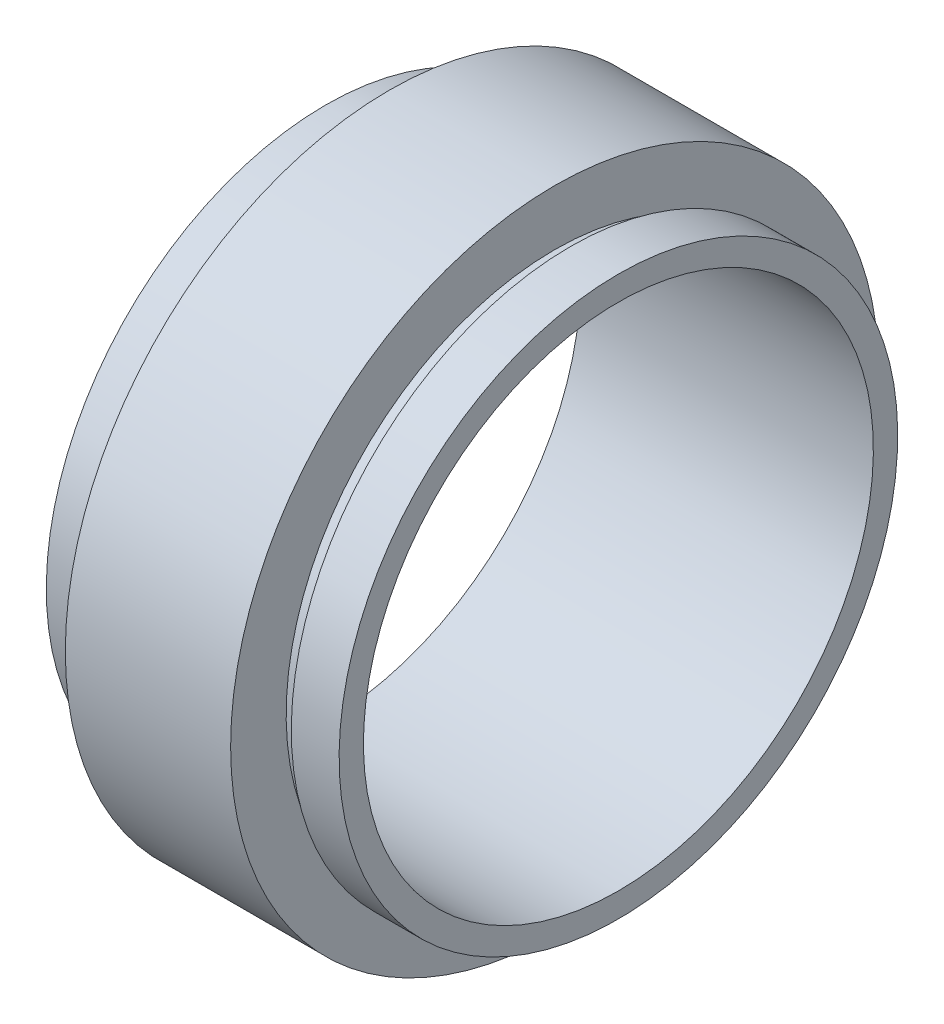
ISO-10303-21;
HEADER;
FILE_DESCRIPTION(('STEP AP214'),'2;1');
FILE_NAME('part.step','',(''),(''),'','','');
FILE_SCHEMA(('AUTOMOTIVE_DESIGN { 1 0 10303 214 1 1 1 1 }'));
ENDSEC;
DATA;
#1=APPLICATION_CONTEXT('core data for automotive mechanical design processes');
#2=APPLICATION_PROTOCOL_DEFINITION('international standard','automotive_design',2000,#1);
#3=PRODUCT_CONTEXT('',#1,'mechanical');
#4=PRODUCT('Part','Part','',(#3));
#5=PRODUCT_RELATED_PRODUCT_CATEGORY('part','',(#4));
#6=PRODUCT_DEFINITION_FORMATION('','',#4);
#7=PRODUCT_DEFINITION_CONTEXT('part definition',#1,'design');
#8=PRODUCT_DEFINITION('design','',#6,#7);
#9=PRODUCT_DEFINITION_SHAPE('','',#8);
#10=(LENGTH_UNIT() NAMED_UNIT(*) SI_UNIT(.MILLI.,.METRE.));
#11=(NAMED_UNIT(*) PLANE_ANGLE_UNIT() SI_UNIT($,.RADIAN.));
#12=(NAMED_UNIT(*) SI_UNIT($,.STERADIAN.) SOLID_ANGLE_UNIT());
#13=UNCERTAINTY_MEASURE_WITH_UNIT(LENGTH_MEASURE(1.E-05),#10,'distance_accuracy_value','');
#14=(GEOMETRIC_REPRESENTATION_CONTEXT(3) GLOBAL_UNCERTAINTY_ASSIGNED_CONTEXT((#13)) GLOBAL_UNIT_ASSIGNED_CONTEXT((#10,
#11,#12)) REPRESENTATION_CONTEXT('',''));
#15=CARTESIAN_POINT('',(0.,0.,0.));
#16=DIRECTION('',(0.,0.,1.));
#17=DIRECTION('',(1.,0.,0.));
#18=AXIS2_PLACEMENT_3D('',#15,#16,#17);
#19=CARTESIAN_POINT('',(6.89,13.1445,0.));
#20=DIRECTION('',(1.,0.,0.));
#21=DIRECTION('',(0.,1.,0.));
#22=AXIS2_PLACEMENT_3D('',#19,#20,#21);
#23=PLANE('',#22);
#24=CARTESIAN_POINT('',(6.89,0.,0.));
#25=DIRECTION('',(-1.,0.,0.));
#26=DIRECTION('',(0.,-1.,0.));
#27=AXIS2_PLACEMENT_3D('',#24,#25,#26);
#28=CIRCLE('',#27,12.);
#29=CARTESIAN_POINT('',(6.89,-12.,0.));
#30=VERTEX_POINT('',#29);
#31=EDGE_CURVE('E71',#30,#30,#28,.T.);
#32=ORIENTED_EDGE('',*,*,#31,.T.);
#33=EDGE_LOOP('',(#32));
#34=FACE_BOUND('',#33,.T.);
#35=CARTESIAN_POINT('',(6.89,0.,0.));
#36=DIRECTION('',(1.,0.,0.));
#37=DIRECTION('',(0.,1.,0.));
#38=AXIS2_PLACEMENT_3D('',#35,#36,#37);
#39=CIRCLE('',#38,13.1445);
#40=CARTESIAN_POINT('',(6.89,13.1445,0.));
#41=VERTEX_POINT('',#40);
#42=EDGE_CURVE('E68',#41,#41,#39,.T.);
#43=ORIENTED_EDGE('',*,*,#42,.T.);
#44=EDGE_LOOP('',(#43));
#45=FACE_BOUND('',#44,.T.);
#46=ADVANCED_FACE('F34',(#34,#45),#23,.T.);
#47=CARTESIAN_POINT('',(-6.89,0.,0.));
#48=DIRECTION('',(-1.,0.,0.));
#49=DIRECTION('',(0.,-1.,0.));
#50=AXIS2_PLACEMENT_3D('',#47,#48,#49);
#51=PLANE('',#50);
#52=CARTESIAN_POINT('',(-6.89,0.,0.));
#53=DIRECTION('',(-1.,0.,0.));
#54=DIRECTION('',(0.,-1.,0.));
#55=AXIS2_PLACEMENT_3D('',#52,#53,#54);
#56=CIRCLE('',#55,12.);
#57=CARTESIAN_POINT('',(-6.89,-12.,0.));
#58=VERTEX_POINT('',#57);
#59=EDGE_CURVE('E72',#58,#58,#56,.T.);
#60=ORIENTED_EDGE('',*,*,#59,.F.);
#61=EDGE_LOOP('',(#60));
#62=FACE_BOUND('',#61,.T.);
#63=CARTESIAN_POINT('',(-6.89,0.,0.));
#64=DIRECTION('',(1.,0.,0.));
#65=DIRECTION('',(0.,1.,0.));
#66=AXIS2_PLACEMENT_3D('',#63,#64,#65);
#67=CIRCLE('',#66,13.1445);
#68=CARTESIAN_POINT('',(-6.89,13.1445,0.));
#69=VERTEX_POINT('',#68);
#70=EDGE_CURVE('E10',#69,#69,#67,.T.);
#71=ORIENTED_EDGE('',*,*,#70,.F.);
#72=EDGE_LOOP('',(#71));
#73=FACE_BOUND('',#72,.T.);
#74=ADVANCED_FACE('F87',(#62,#73),#51,.T.);
#75=CARTESIAN_POINT('',(6.89,0.,0.));
#76=DIRECTION('',(1.,0.,0.));
#77=DIRECTION('',(0.,1.,0.));
#78=AXIS2_PLACEMENT_3D('',#75,#76,#77);
#79=CYLINDRICAL_SURFACE('',#78,13.1445);
#80=ORIENTED_EDGE('',*,*,#70,.T.);
#81=EDGE_LOOP('',(#80));
#82=FACE_BOUND('',#81,.T.);
#83=CARTESIAN_POINT('',(-4.64,0.,0.));
#84=DIRECTION('',(1.,0.,0.));
#85=DIRECTION('',(0.,1.,0.));
#86=AXIS2_PLACEMENT_3D('',#83,#84,#85);
#87=CIRCLE('',#86,13.1445);
#88=CARTESIAN_POINT('',(-4.64,13.1445,0.));
#89=VERTEX_POINT('',#88);
#90=EDGE_CURVE('E40',#89,#89,#87,.T.);
#91=ORIENTED_EDGE('',*,*,#90,.F.);
#92=EDGE_LOOP('',(#91));
#93=FACE_BOUND('',#92,.T.);
#94=ADVANCED_FACE('F90',(#82,#93),#79,.T.);
#95=CARTESIAN_POINT('',(-4.64,13.1445,0.));
#96=DIRECTION('',(1.,0.,0.));
#97=DIRECTION('',(0.,1.,0.));
#98=AXIS2_PLACEMENT_3D('',#95,#96,#97);
#99=PLANE('',#98);
#100=ORIENTED_EDGE('',*,*,#90,.T.);
#101=EDGE_LOOP('',(#100));
#102=FACE_BOUND('',#101,.T.);
#103=CARTESIAN_POINT('',(-4.64,0.,0.));
#104=DIRECTION('',(1.,0.,0.));
#105=DIRECTION('',(0.,1.,0.));
#106=AXIS2_PLACEMENT_3D('',#103,#104,#105);
#107=CIRCLE('',#106,12.6365);
#108=CARTESIAN_POINT('',(-4.64,12.6365,0.));
#109=VERTEX_POINT('',#108);
#110=EDGE_CURVE('E44',#109,#109,#107,.T.);
#111=ORIENTED_EDGE('',*,*,#110,.F.);
#112=EDGE_LOOP('',(#111));
#113=FACE_BOUND('',#112,.T.);
#114=ADVANCED_FACE('F95',(#102,#113),#99,.T.);
#115=CARTESIAN_POINT('',(6.89,0.,0.));
#116=DIRECTION('',(1.,0.,0.));
#117=DIRECTION('',(0.,1.,0.));
#118=AXIS2_PLACEMENT_3D('',#115,#116,#117);
#119=CYLINDRICAL_SURFACE('',#118,12.6365);
#120=ORIENTED_EDGE('',*,*,#110,.T.);
#121=EDGE_LOOP('',(#120));
#122=FACE_BOUND('',#121,.T.);
#123=CARTESIAN_POINT('',(-3.89,0.,0.));
#124=DIRECTION('',(1.,0.,0.));
#125=DIRECTION('',(0.,1.,0.));
#126=AXIS2_PLACEMENT_3D('',#123,#124,#125);
#127=CIRCLE('',#126,12.6365);
#128=CARTESIAN_POINT('',(-3.89,12.6365,0.));
#129=VERTEX_POINT('',#128);
#130=EDGE_CURVE('E48',#129,#129,#127,.T.);
#131=ORIENTED_EDGE('',*,*,#130,.F.);
#132=EDGE_LOOP('',(#131));
#133=FACE_BOUND('',#132,.T.);
#134=ADVANCED_FACE('F100',(#122,#133),#119,.T.);
#135=CARTESIAN_POINT('',(-3.89,12.6365,0.));
#136=DIRECTION('',(-1.,0.,0.));
#137=DIRECTION('',(0.,-1.,0.));
#138=AXIS2_PLACEMENT_3D('',#135,#136,#137);
#139=PLANE('',#138);
#140=ORIENTED_EDGE('',*,*,#130,.T.);
#141=EDGE_LOOP('',(#140));
#142=FACE_BOUND('',#141,.T.);
#143=CARTESIAN_POINT('',(-3.89,0.,0.));
#144=DIRECTION('',(1.,0.,0.));
#145=DIRECTION('',(0.,1.,0.));
#146=AXIS2_PLACEMENT_3D('',#143,#144,#145);
#147=CIRCLE('',#146,15.25);
#148=CARTESIAN_POINT('',(-3.89,15.25,0.));
#149=VERTEX_POINT('',#148);
#150=EDGE_CURVE('E53',#149,#149,#147,.T.);
#151=ORIENTED_EDGE('',*,*,#150,.F.);
#152=EDGE_LOOP('',(#151));
#153=FACE_BOUND('',#152,.T.);
#154=ADVANCED_FACE('F103',(#142,#153),#139,.T.);
#155=CARTESIAN_POINT('',(6.89,0.,0.));
#156=DIRECTION('',(1.,0.,0.));
#157=DIRECTION('',(0.,1.,0.));
#158=AXIS2_PLACEMENT_3D('',#155,#156,#157);
#159=CYLINDRICAL_SURFACE('',#158,15.25);
#160=ORIENTED_EDGE('',*,*,#150,.T.);
#161=EDGE_LOOP('',(#160));
#162=FACE_BOUND('',#161,.T.);
#163=CARTESIAN_POINT('',(3.89,0.,0.));
#164=DIRECTION('',(1.,0.,0.));
#165=DIRECTION('',(0.,1.,0.));
#166=AXIS2_PLACEMENT_3D('',#163,#164,#165);
#167=CIRCLE('',#166,15.25);
#168=CARTESIAN_POINT('',(3.89,15.25,0.));
#169=VERTEX_POINT('',#168);
#170=EDGE_CURVE('E56',#169,#169,#167,.T.);
#171=ORIENTED_EDGE('',*,*,#170,.F.);
#172=EDGE_LOOP('',(#171));
#173=FACE_BOUND('',#172,.T.);
#174=ADVANCED_FACE('F107',(#162,#173),#159,.T.);
#175=CARTESIAN_POINT('',(3.89,15.25,0.));
#176=DIRECTION('',(1.,0.,0.));
#177=DIRECTION('',(0.,1.,0.));
#178=AXIS2_PLACEMENT_3D('',#175,#176,#177);
#179=PLANE('',#178);
#180=ORIENTED_EDGE('',*,*,#170,.T.);
#181=EDGE_LOOP('',(#180));
#182=FACE_BOUND('',#181,.T.);
#183=CARTESIAN_POINT('',(3.89,0.,0.));
#184=DIRECTION('',(1.,0.,0.));
#185=DIRECTION('',(0.,1.,0.));
#186=AXIS2_PLACEMENT_3D('',#183,#184,#185);
#187=CIRCLE('',#186,12.6365);
#188=CARTESIAN_POINT('',(3.89,12.6365,0.));
#189=VERTEX_POINT('',#188);
#190=EDGE_CURVE('E59',#189,#189,#187,.T.);
#191=ORIENTED_EDGE('',*,*,#190,.F.);
#192=EDGE_LOOP('',(#191));
#193=FACE_BOUND('',#192,.T.);
#194=ADVANCED_FACE('F111',(#182,#193),#179,.T.);
#195=CARTESIAN_POINT('',(6.89,0.,0.));
#196=DIRECTION('',(1.,0.,0.));
#197=DIRECTION('',(0.,1.,0.));
#198=AXIS2_PLACEMENT_3D('',#195,#196,#197);
#199=CYLINDRICAL_SURFACE('',#198,12.6365);
#200=ORIENTED_EDGE('',*,*,#190,.T.);
#201=EDGE_LOOP('',(#200));
#202=FACE_BOUND('',#201,.T.);
#203=CARTESIAN_POINT('',(4.64,0.,0.));
#204=DIRECTION('',(1.,0.,0.));
#205=DIRECTION('',(0.,1.,0.));
#206=AXIS2_PLACEMENT_3D('',#203,#204,#205);
#207=CIRCLE('',#206,12.6365);
#208=CARTESIAN_POINT('',(4.64,12.6365,0.));
#209=VERTEX_POINT('',#208);
#210=EDGE_CURVE('E62',#209,#209,#207,.T.);
#211=ORIENTED_EDGE('',*,*,#210,.F.);
#212=EDGE_LOOP('',(#211));
#213=FACE_BOUND('',#212,.T.);
#214=ADVANCED_FACE('F115',(#202,#213),#199,.T.);
#215=CARTESIAN_POINT('',(4.64,12.6365,0.));
#216=DIRECTION('',(-1.,0.,0.));
#217=DIRECTION('',(0.,-1.,0.));
#218=AXIS2_PLACEMENT_3D('',#215,#216,#217);
#219=PLANE('',#218);
#220=ORIENTED_EDGE('',*,*,#210,.T.);
#221=EDGE_LOOP('',(#220));
#222=FACE_BOUND('',#221,.T.);
#223=CARTESIAN_POINT('',(4.64,0.,0.));
#224=DIRECTION('',(1.,0.,0.));
#225=DIRECTION('',(0.,1.,0.));
#226=AXIS2_PLACEMENT_3D('',#223,#224,#225);
#227=CIRCLE('',#226,13.1445);
#228=CARTESIAN_POINT('',(4.64,13.1445,0.));
#229=VERTEX_POINT('',#228);
#230=EDGE_CURVE('E65',#229,#229,#227,.T.);
#231=ORIENTED_EDGE('',*,*,#230,.F.);
#232=EDGE_LOOP('',(#231));
#233=FACE_BOUND('',#232,.T.);
#234=ADVANCED_FACE('F119',(#222,#233),#219,.T.);
#235=CARTESIAN_POINT('',(6.89,0.,0.));
#236=DIRECTION('',(1.,0.,0.));
#237=DIRECTION('',(0.,1.,0.));
#238=AXIS2_PLACEMENT_3D('',#235,#236,#237);
#239=CYLINDRICAL_SURFACE('',#238,13.1445);
#240=ORIENTED_EDGE('',*,*,#230,.T.);
#241=EDGE_LOOP('',(#240));
#242=FACE_BOUND('',#241,.T.);
#243=ORIENTED_EDGE('',*,*,#42,.F.);
#244=EDGE_LOOP('',(#243));
#245=FACE_BOUND('',#244,.T.);
#246=ADVANCED_FACE('F83',(#242,#245),#239,.T.);
#247=CARTESIAN_POINT('',(6.89,0.,0.));
#248=DIRECTION('',(-1.,0.,0.));
#249=DIRECTION('',(0.,-1.,0.));
#250=AXIS2_PLACEMENT_3D('',#247,#248,#249);
#251=CYLINDRICAL_SURFACE('',#250,12.);
#252=CARTESIAN_POINT('',(6.89,-12.,0.));
#253=CARTESIAN_POINT('',(6.74645833333333,-12.,0.));
#254=CARTESIAN_POINT('',(6.60291666666667,-12.,0.));
#255=CARTESIAN_POINT('',(6.31583333333333,-12.,0.));
#256=CARTESIAN_POINT('',(6.17229166666667,-12.,0.));
#257=CARTESIAN_POINT('',(5.88520833333333,-12.,0.));
#258=CARTESIAN_POINT('',(5.74166666666667,-12.,0.));
#259=CARTESIAN_POINT('',(5.45458333333333,-12.,0.));
#260=CARTESIAN_POINT('',(5.31104166666667,-12.,0.));
#261=CARTESIAN_POINT('',(5.02395833333333,-12.,0.));
#262=CARTESIAN_POINT('',(4.88041666666667,-12.,0.));
#263=CARTESIAN_POINT('',(4.59333333333333,-12.,0.));
#264=CARTESIAN_POINT('',(4.44979166666667,-12.,0.));
#265=CARTESIAN_POINT('',(4.16270833333333,-12.,0.));
#266=CARTESIAN_POINT('',(4.01916666666667,-12.,0.));
#267=CARTESIAN_POINT('',(3.73208333333333,-12.,0.));
#268=CARTESIAN_POINT('',(3.58854166666667,-12.,0.));
#269=CARTESIAN_POINT('',(3.30145833333333,-12.,0.));
#270=CARTESIAN_POINT('',(3.15791666666667,-12.,0.));
#271=CARTESIAN_POINT('',(2.87083333333333,-12.,0.));
#272=CARTESIAN_POINT('',(2.72729166666667,-12.,0.));
#273=CARTESIAN_POINT('',(2.44020833333333,-12.,0.));
#274=CARTESIAN_POINT('',(2.29666666666667,-12.,0.));
#275=CARTESIAN_POINT('',(2.00958333333333,-12.,0.));
#276=CARTESIAN_POINT('',(1.86604166666667,-12.,0.));
#277=CARTESIAN_POINT('',(1.57895833333333,-12.,0.));
#278=CARTESIAN_POINT('',(1.43541666666667,-12.,0.));
#279=CARTESIAN_POINT('',(1.14833333333333,-12.,0.));
#280=CARTESIAN_POINT('',(1.00479166666667,-12.,0.));
#281=CARTESIAN_POINT('',(0.717708333333332,-12.,0.));
#282=CARTESIAN_POINT('',(0.574166666666665,-12.,0.));
#283=CARTESIAN_POINT('',(0.287083333333332,-12.,0.));
#284=CARTESIAN_POINT('',(0.143541666666665,-12.,0.));
#285=CARTESIAN_POINT('',(-0.143541666666669,-12.,0.));
#286=CARTESIAN_POINT('',(-0.287083333333335,-12.,0.));
#287=CARTESIAN_POINT('',(-0.574166666666669,-12.,0.));
#288=CARTESIAN_POINT('',(-0.717708333333335,-12.,0.));
#289=CARTESIAN_POINT('',(-1.00479166666667,-12.,0.));
#290=CARTESIAN_POINT('',(-1.14833333333333,-12.,0.));
#291=CARTESIAN_POINT('',(-1.43541666666667,-12.,0.));
#292=CARTESIAN_POINT('',(-1.57895833333333,-12.,0.));
#293=CARTESIAN_POINT('',(-1.86604166666667,-12.,0.));
#294=CARTESIAN_POINT('',(-2.00958333333333,-12.,0.));
#295=CARTESIAN_POINT('',(-2.29666666666667,-12.,0.));
#296=CARTESIAN_POINT('',(-2.44020833333333,-12.,0.));
#297=CARTESIAN_POINT('',(-2.72729166666667,-12.,0.));
#298=CARTESIAN_POINT('',(-2.87083333333333,-12.,0.));
#299=CARTESIAN_POINT('',(-3.15791666666667,-12.,0.));
#300=CARTESIAN_POINT('',(-3.30145833333333,-12.,0.));
#301=CARTESIAN_POINT('',(-3.58854166666667,-12.,0.));
#302=CARTESIAN_POINT('',(-3.73208333333333,-12.,0.));
#303=CARTESIAN_POINT('',(-4.01916666666667,-12.,0.));
#304=CARTESIAN_POINT('',(-4.16270833333333,-12.,0.));
#305=CARTESIAN_POINT('',(-4.44979166666667,-12.,0.));
#306=CARTESIAN_POINT('',(-4.59333333333333,-12.,0.));
#307=CARTESIAN_POINT('',(-4.88041666666667,-12.,0.));
#308=CARTESIAN_POINT('',(-5.02395833333334,-12.,0.));
#309=CARTESIAN_POINT('',(-5.31104166666667,-12.,0.));
#310=CARTESIAN_POINT('',(-5.45458333333334,-12.,0.));
#311=CARTESIAN_POINT('',(-5.74166666666667,-12.,0.));
#312=CARTESIAN_POINT('',(-5.88520833333334,-12.,0.));
#313=CARTESIAN_POINT('',(-6.17229166666667,-12.,0.));
#314=CARTESIAN_POINT('',(-6.31583333333333,-12.,0.));
#315=CARTESIAN_POINT('',(-6.60291666666667,-12.,0.));
#316=CARTESIAN_POINT('',(-6.74645833333333,-12.,0.));
#317=CARTESIAN_POINT('',(-6.89,-12.,0.));
#318=B_SPLINE_CURVE_WITH_KNOTS('',3,(#252,#253,#254,#255,#256,#257,#258,#259,#260,#261,#262,
#263,#264,#265,#266,#267,#268,#269,#270,#271,#272,#273,#274,#275,#276,#277,#278,#279,#280,#281,
#282,#283,#284,#285,#286,#287,#288,#289,#290,#291,#292,#293,#294,#295,#296,#297,#298,#299,#300,
#301,#302,#303,#304,#305,#306,#307,#308,#309,#310,#311,#312,#313,#314,#315,#316,#317),
.UNSPECIFIED.,.F.,.F.,(4,2,2,2,2,2,2,2,2,2,2,2,2,2,2,2,2,2,2,2,2,2,2,2,2,2,2,2,2,2,2,2,4),(0.,
0.430625,0.86125,1.291875,1.7225,2.153125,2.58375,3.014375,3.445,3.875625,4.30625,4.736875,
5.1675,5.598125,6.02875,6.459375,6.89,7.320625,7.75125,8.181875,8.6125,9.043125,9.47375,
9.904375,10.335,10.765625,11.19625,11.626875,12.0575,12.488125,12.91875,13.349375,13.78),.UNSPECIFIED.);
#319=EDGE_CURVE('BSEAM80',#30,#58,#318,.T.);
#320=ORIENTED_EDGE('',*,*,#31,.F.);
#321=ORIENTED_EDGE('',*,*,#59,.T.);
#322=ORIENTED_EDGE('',*,*,#319,.T.);
#323=ORIENTED_EDGE('',*,*,#319,.F.);
#324=EDGE_LOOP('',(#320,#322,#321,#323));
#325=FACE_BOUND('',#324,.T.);
#326=ADVANCED_FACE('F80',(#325),#251,.F.);
#327=CLOSED_SHELL('',(#46,#74,#94,#114,#134,#154,#174,#194,#214,#234,#246,#326));
#328=MANIFOLD_SOLID_BREP('B2',#327);
#329=ADVANCED_BREP_SHAPE_REPRESENTATION('',(#18,#328),#14);
#330=SHAPE_DEFINITION_REPRESENTATION(#9,#329);
ENDSEC;
END-ISO-10303-21;
